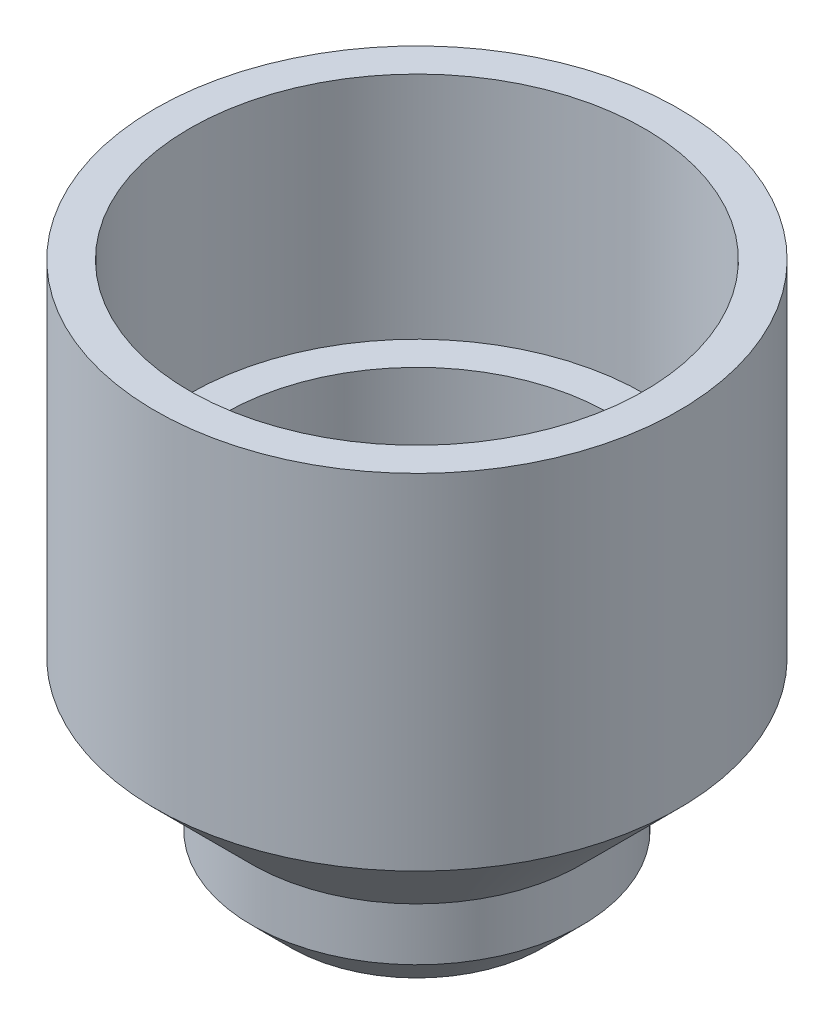
ISO-10303-21;
HEADER;
FILE_DESCRIPTION(('STEP AP214'),'2;1');
FILE_NAME('part.step','',(''),(''),'','','');
FILE_SCHEMA(('AUTOMOTIVE_DESIGN { 1 0 10303 214 1 1 1 1 }'));
ENDSEC;
DATA;
#1=APPLICATION_CONTEXT('core data for automotive mechanical design processes');
#2=APPLICATION_PROTOCOL_DEFINITION('international standard','automotive_design',2000,#1);
#3=PRODUCT_CONTEXT('',#1,'mechanical');
#4=PRODUCT('Part','Part','',(#3));
#5=PRODUCT_RELATED_PRODUCT_CATEGORY('part','',(#4));
#6=PRODUCT_DEFINITION_FORMATION('','',#4);
#7=PRODUCT_DEFINITION_CONTEXT('part definition',#1,'design');
#8=PRODUCT_DEFINITION('design','',#6,#7);
#9=PRODUCT_DEFINITION_SHAPE('','',#8);
#10=(LENGTH_UNIT() NAMED_UNIT(*) SI_UNIT(.MILLI.,.METRE.));
#11=(NAMED_UNIT(*) PLANE_ANGLE_UNIT() SI_UNIT($,.RADIAN.));
#12=(NAMED_UNIT(*) SI_UNIT($,.STERADIAN.) SOLID_ANGLE_UNIT());
#13=UNCERTAINTY_MEASURE_WITH_UNIT(LENGTH_MEASURE(1.E-05),#10,'distance_accuracy_value','');
#14=(GEOMETRIC_REPRESENTATION_CONTEXT(3) GLOBAL_UNCERTAINTY_ASSIGNED_CONTEXT((#13)) GLOBAL_UNIT_ASSIGNED_CONTEXT((#10,
#11,#12)) REPRESENTATION_CONTEXT('',''));
#15=CARTESIAN_POINT('',(0.,0.,0.));
#16=DIRECTION('',(0.,0.,1.));
#17=DIRECTION('',(1.,0.,0.));
#18=AXIS2_PLACEMENT_3D('',#15,#16,#17);
#19=CARTESIAN_POINT('',(0.,51.2741946401641,0.));
#20=DIRECTION('',(0.,1.,0.));
#21=DIRECTION('',(-1.,0.,0.));
#22=AXIS2_PLACEMENT_3D('',#19,#20,#21);
#23=CYLINDRICAL_SURFACE('',#22,7.18025360760885);
#24=CARTESIAN_POINT('',(0.,-6.51531827806546,0.));
#25=DIRECTION('',(0.,1.,0.));
#26=DIRECTION('',(-1.,0.,0.));
#27=AXIS2_PLACEMENT_3D('',#24,#25,#26);
#28=CIRCLE('',#27,7.18025360760885);
#29=CARTESIAN_POINT('',(-7.18025360760884,-6.51531827806546,0.));
#30=VERTEX_POINT('',#29);
#31=EDGE_CURVE('E70',#30,#30,#28,.T.);
#32=ORIENTED_EDGE('',*,*,#31,.T.);
#33=EDGE_LOOP('',(#32));
#34=FACE_BOUND('',#33,.T.);
#35=CARTESIAN_POINT('',(0.,-4.21974639239114,0.));
#36=DIRECTION('',(0.,1.,0.));
#37=DIRECTION('',(-1.,0.,0.));
#38=AXIS2_PLACEMENT_3D('',#35,#36,#37);
#39=CIRCLE('',#38,7.18025360760885);
#40=CARTESIAN_POINT('',(-7.18025360760884,-4.21974639239114,0.));
#41=VERTEX_POINT('',#40);
#42=EDGE_CURVE('E10',#41,#41,#39,.T.);
#43=ORIENTED_EDGE('',*,*,#42,.F.);
#44=EDGE_LOOP('',(#43));
#45=FACE_BOUND('',#44,.T.);
#46=ADVANCED_FACE('F36',(#34,#45),#23,.T.);
#47=CARTESIAN_POINT('',(0.,0.,0.));
#48=DIRECTION('',(0.,1.,0.));
#49=DIRECTION('',(-1.,0.,0.));
#50=AXIS2_PLACEMENT_3D('',#47,#48,#49);
#51=CONICAL_SURFACE('',#50,11.4,0.785398163397447);
#52=ORIENTED_EDGE('',*,*,#42,.T.);
#53=EDGE_LOOP('',(#52));
#54=FACE_BOUND('',#53,.T.);
#55=CARTESIAN_POINT('',(0.,0.,0.));
#56=DIRECTION('',(0.,1.,0.));
#57=DIRECTION('',(-1.,0.,0.));
#58=AXIS2_PLACEMENT_3D('',#55,#56,#57);
#59=CIRCLE('',#58,11.4);
#60=CARTESIAN_POINT('',(-11.4,0.,0.));
#61=VERTEX_POINT('',#60);
#62=EDGE_CURVE('E42',#61,#61,#59,.T.);
#63=ORIENTED_EDGE('',*,*,#62,.F.);
#64=EDGE_LOOP('',(#63));
#65=FACE_BOUND('',#64,.T.);
#66=ADVANCED_FACE('F112',(#54,#65),#51,.T.);
#67=CARTESIAN_POINT('',(0.,51.2741946401641,0.));
#68=DIRECTION('',(0.,1.,0.));
#69=DIRECTION('',(-1.,0.,0.));
#70=AXIS2_PLACEMENT_3D('',#67,#68,#69);
#71=CYLINDRICAL_SURFACE('',#70,11.4);
#72=CARTESIAN_POINT('',(0.,15.,0.));
#73=DIRECTION('',(0.,1.,0.));
#74=DIRECTION('',(-1.,0.,0.));
#75=AXIS2_PLACEMENT_3D('',#72,#73,#74);
#76=CIRCLE('',#75,11.4);
#77=CARTESIAN_POINT('',(-11.4,15.,0.));
#78=VERTEX_POINT('',#77);
#79=EDGE_CURVE('E46',#78,#78,#76,.T.);
#80=ORIENTED_EDGE('',*,*,#79,.F.);
#81=EDGE_LOOP('',(#80));
#82=FACE_BOUND('',#81,.T.);
#83=ORIENTED_EDGE('',*,*,#62,.T.);
#84=EDGE_LOOP('',(#83));
#85=FACE_BOUND('',#84,.T.);
#86=ADVANCED_FACE('F116',(#82,#85),#71,.T.);
#87=CARTESIAN_POINT('',(0.,15.,0.));
#88=DIRECTION('',(0.,1.,0.));
#89=DIRECTION('',(-1.,0.,0.));
#90=AXIS2_PLACEMENT_3D('',#87,#88,#89);
#91=PLANE('',#90);
#92=ORIENTED_EDGE('',*,*,#79,.T.);
#93=EDGE_LOOP('',(#92));
#94=FACE_BOUND('',#93,.T.);
#95=CARTESIAN_POINT('',(0.,15.,0.));
#96=DIRECTION('',(0.,1.,0.));
#97=DIRECTION('',(-1.,0.,0.));
#98=AXIS2_PLACEMENT_3D('',#95,#96,#97);
#99=CIRCLE('',#98,9.89999999999999);
#100=CARTESIAN_POINT('',(-9.89999999999999,15.,0.));
#101=VERTEX_POINT('',#100);
#102=EDGE_CURVE('E50',#101,#101,#99,.T.);
#103=ORIENTED_EDGE('',*,*,#102,.F.);
#104=EDGE_LOOP('',(#103));
#105=FACE_BOUND('',#104,.T.);
#106=ADVANCED_FACE('F108',(#94,#105),#91,.T.);
#107=CARTESIAN_POINT('',(0.,51.2741946401641,0.));
#108=DIRECTION('',(0.,1.,0.));
#109=DIRECTION('',(-1.,0.,0.));
#110=AXIS2_PLACEMENT_3D('',#107,#108,#109);
#111=CYLINDRICAL_SURFACE('',#110,9.9);
#112=CARTESIAN_POINT('',(0.,5.,0.));
#113=DIRECTION('',(0.,1.,0.));
#114=DIRECTION('',(-1.,0.,0.));
#115=AXIS2_PLACEMENT_3D('',#112,#113,#114);
#116=CIRCLE('',#115,9.9);
#117=CARTESIAN_POINT('',(-9.89999999999999,5.,0.));
#118=VERTEX_POINT('',#117);
#119=EDGE_CURVE('E55',#118,#118,#116,.T.);
#120=ORIENTED_EDGE('',*,*,#119,.F.);
#121=EDGE_LOOP('',(#120));
#122=FACE_BOUND('',#121,.T.);
#123=ORIENTED_EDGE('',*,*,#102,.T.);
#124=EDGE_LOOP('',(#123));
#125=FACE_BOUND('',#124,.T.);
#126=ADVANCED_FACE('F102',(#122,#125),#111,.F.);
#127=CARTESIAN_POINT('',(0.,5.,0.));
#128=DIRECTION('',(0.,1.,0.));
#129=DIRECTION('',(-1.,0.,0.));
#130=AXIS2_PLACEMENT_3D('',#127,#128,#129);
#131=PLANE('',#130);
#132=ORIENTED_EDGE('',*,*,#119,.T.);
#133=EDGE_LOOP('',(#132));
#134=FACE_BOUND('',#133,.T.);
#135=CARTESIAN_POINT('',(0.,5.,0.));
#136=DIRECTION('',(0.,1.,0.));
#137=DIRECTION('',(-1.,0.,0.));
#138=AXIS2_PLACEMENT_3D('',#135,#136,#137);
#139=CIRCLE('',#138,8.4);
#140=CARTESIAN_POINT('',(-8.39999999999999,5.,0.));
#141=VERTEX_POINT('',#140);
#142=EDGE_CURVE('E58',#141,#141,#139,.T.);
#143=ORIENTED_EDGE('',*,*,#142,.F.);
#144=EDGE_LOOP('',(#143));
#145=FACE_BOUND('',#144,.T.);
#146=ADVANCED_FACE('F97',(#134,#145),#131,.T.);
#147=CARTESIAN_POINT('',(0.,51.2741946401641,0.));
#148=DIRECTION('',(0.,1.,0.));
#149=DIRECTION('',(-1.,0.,0.));
#150=AXIS2_PLACEMENT_3D('',#147,#148,#149);
#151=CYLINDRICAL_SURFACE('',#150,8.4);
#152=CARTESIAN_POINT('',(0.,0.,0.));
#153=DIRECTION('',(0.,1.,0.));
#154=DIRECTION('',(-1.,0.,0.));
#155=AXIS2_PLACEMENT_3D('',#152,#153,#154);
#156=CIRCLE('',#155,8.4);
#157=CARTESIAN_POINT('',(-8.39999999999999,0.,0.));
#158=VERTEX_POINT('',#157);
#159=EDGE_CURVE('E61',#158,#158,#156,.T.);
#160=ORIENTED_EDGE('',*,*,#159,.F.);
#161=EDGE_LOOP('',(#160));
#162=FACE_BOUND('',#161,.T.);
#163=ORIENTED_EDGE('',*,*,#142,.T.);
#164=EDGE_LOOP('',(#163));
#165=FACE_BOUND('',#164,.T.);
#166=ADVANCED_FACE('F91',(#162,#165),#151,.F.);
#167=CARTESIAN_POINT('',(0.,0.,0.));
#168=DIRECTION('',(0.,1.,0.));
#169=DIRECTION('',(-1.,0.,0.));
#170=AXIS2_PLACEMENT_3D('',#167,#168,#169);
#171=CONICAL_SURFACE('',#170,8.4,0.785398163397448);
#172=CARTESIAN_POINT('',(0.,-2.91974639239114,0.));
#173=DIRECTION('',(0.,1.,0.));
#174=DIRECTION('',(-1.,0.,0.));
#175=AXIS2_PLACEMENT_3D('',#172,#173,#174);
#176=CIRCLE('',#175,5.48025360760885);
#177=CARTESIAN_POINT('',(-5.48025360760884,-2.91974639239114,0.));
#178=VERTEX_POINT('',#177);
#179=EDGE_CURVE('E64',#178,#178,#176,.T.);
#180=ORIENTED_EDGE('',*,*,#179,.F.);
#181=EDGE_LOOP('',(#180));
#182=FACE_BOUND('',#181,.T.);
#183=ORIENTED_EDGE('',*,*,#159,.T.);
#184=EDGE_LOOP('',(#183));
#185=FACE_BOUND('',#184,.T.);
#186=ADVANCED_FACE('F85',(#182,#185),#171,.F.);
#187=CARTESIAN_POINT('',(0.,51.2741946401641,0.));
#188=DIRECTION('',(0.,1.,0.));
#189=DIRECTION('',(-1.,0.,0.));
#190=AXIS2_PLACEMENT_3D('',#187,#188,#189);
#191=CYLINDRICAL_SURFACE('',#190,5.48025360760885);
#192=CARTESIAN_POINT('',(0.,-8.21531827806547,0.));
#193=DIRECTION('',(0.,1.,0.));
#194=DIRECTION('',(-1.,0.,0.));
#195=AXIS2_PLACEMENT_3D('',#192,#193,#194);
#196=CIRCLE('',#195,5.48025360760885);
#197=CARTESIAN_POINT('',(-5.48025360760884,-8.21531827806547,0.));
#198=VERTEX_POINT('',#197);
#199=EDGE_CURVE('E67',#198,#198,#196,.T.);
#200=ORIENTED_EDGE('',*,*,#199,.F.);
#201=EDGE_LOOP('',(#200));
#202=FACE_BOUND('',#201,.T.);
#203=ORIENTED_EDGE('',*,*,#179,.T.);
#204=EDGE_LOOP('',(#203));
#205=FACE_BOUND('',#204,.T.);
#206=ADVANCED_FACE('F79',(#202,#205),#191,.F.);
#207=CARTESIAN_POINT('',(0.,-8.21531827806547,0.));
#208=DIRECTION('',(0.,1.,0.));
#209=DIRECTION('',(-1.,0.,0.));
#210=AXIS2_PLACEMENT_3D('',#207,#208,#209);
#211=CONICAL_SURFACE('',#210,5.48025360760885,0.785398163397446);
#212=ORIENTED_EDGE('',*,*,#31,.F.);
#213=EDGE_LOOP('',(#212));
#214=FACE_BOUND('',#213,.T.);
#215=ORIENTED_EDGE('',*,*,#199,.T.);
#216=EDGE_LOOP('',(#215));
#217=FACE_BOUND('',#216,.T.);
#218=ADVANCED_FACE('F76',(#214,#217),#211,.T.);
#219=CLOSED_SHELL('',(#46,#66,#86,#106,#126,#146,#166,#186,#206,#218));
#220=MANIFOLD_SOLID_BREP('B2',#219);
#221=ADVANCED_BREP_SHAPE_REPRESENTATION('',(#18,#220),#14);
#222=SHAPE_DEFINITION_REPRESENTATION(#9,#221);
ENDSEC;
END-ISO-10303-21;
